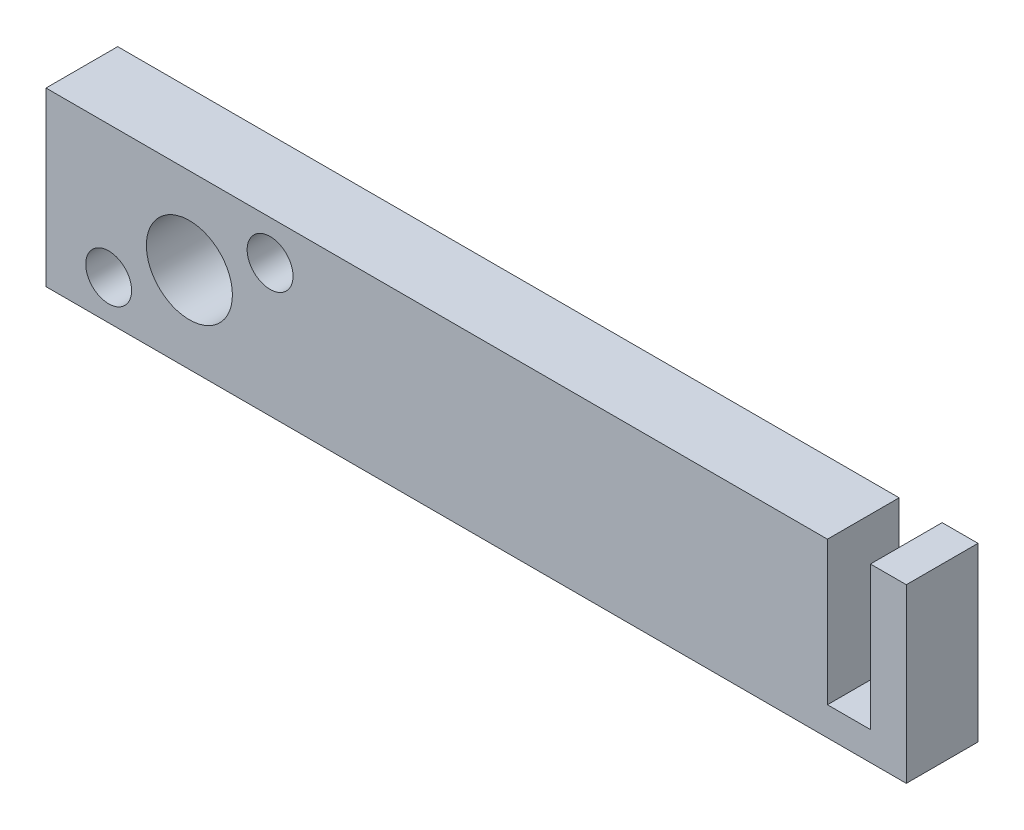
ISO-10303-21;
HEADER;
FILE_DESCRIPTION(('STEP AP214'),'2;1');
FILE_NAME('part.step','',(''),(''),'','','');
FILE_SCHEMA(('AUTOMOTIVE_DESIGN { 1 0 10303 214 1 1 1 1 }'));
ENDSEC;
DATA;
#1=APPLICATION_CONTEXT('core data for automotive mechanical design processes');
#2=APPLICATION_PROTOCOL_DEFINITION('international standard','automotive_design',2000,#1);
#3=PRODUCT_CONTEXT('',#1,'mechanical');
#4=PRODUCT('Part','Part','',(#3));
#5=PRODUCT_RELATED_PRODUCT_CATEGORY('part','',(#4));
#6=PRODUCT_DEFINITION_FORMATION('','',#4);
#7=PRODUCT_DEFINITION_CONTEXT('part definition',#1,'design');
#8=PRODUCT_DEFINITION('design','',#6,#7);
#9=PRODUCT_DEFINITION_SHAPE('','',#8);
#10=(LENGTH_UNIT() NAMED_UNIT(*) SI_UNIT(.MILLI.,.METRE.));
#11=(NAMED_UNIT(*) PLANE_ANGLE_UNIT() SI_UNIT($,.RADIAN.));
#12=(NAMED_UNIT(*) SI_UNIT($,.STERADIAN.) SOLID_ANGLE_UNIT());
#13=UNCERTAINTY_MEASURE_WITH_UNIT(LENGTH_MEASURE(1.E-05),#10,'distance_accuracy_value','');
#14=(GEOMETRIC_REPRESENTATION_CONTEXT(3) GLOBAL_UNCERTAINTY_ASSIGNED_CONTEXT((#13)) GLOBAL_UNIT_ASSIGNED_CONTEXT((#10,
#11,#12)) REPRESENTATION_CONTEXT('',''));
#15=CARTESIAN_POINT('',(0.,0.,0.));
#16=DIRECTION('',(0.,0.,1.));
#17=DIRECTION('',(1.,0.,0.));
#18=AXIS2_PLACEMENT_3D('',#15,#16,#17);
#19=CARTESIAN_POINT('',(-9.99999999999999,0.,5.));
#20=DIRECTION('',(1.,0.,0.));
#21=DIRECTION('',(0.,0.,-1.));
#22=AXIS2_PLACEMENT_3D('',#19,#20,#21);
#23=PLANE('',#22);
#24=DIRECTION('',(0.,-1.,0.));
#25=VECTOR('',#24,1.);
#26=CARTESIAN_POINT('',(-9.99999999999999,0.,0.));
#27=LINE('',#26,#25);
#28=CARTESIAN_POINT('',(-9.99999999999999,6.,0.));
#29=VERTEX_POINT('',#28);
#30=CARTESIAN_POINT('',(-9.99999999999999,-6.,0.));
#31=VERTEX_POINT('',#30);
#32=EDGE_CURVE('E145',#29,#31,#27,.T.);
#33=ORIENTED_EDGE('',*,*,#32,.T.);
#34=DIRECTION('',(0.,0.,-1.));
#35=VECTOR('',#34,1.);
#36=CARTESIAN_POINT('',(-9.99999999999999,-6.,5.));
#37=LINE('',#36,#35);
#38=CARTESIAN_POINT('',(-9.99999999999999,-6.,5.));
#39=VERTEX_POINT('',#38);
#40=EDGE_CURVE('E11',#39,#31,#37,.T.);
#41=ORIENTED_EDGE('',*,*,#40,.F.);
#42=DIRECTION('',(0.,-1.,0.));
#43=VECTOR('',#42,1.);
#44=CARTESIAN_POINT('',(-9.99999999999999,0.,5.));
#45=LINE('',#44,#43);
#46=CARTESIAN_POINT('',(-9.99999999999999,6.,5.));
#47=VERTEX_POINT('',#46);
#48=EDGE_CURVE('E195',#47,#39,#45,.T.);
#49=ORIENTED_EDGE('',*,*,#48,.F.);
#50=DIRECTION('',(0.,0.,-1.));
#51=VECTOR('',#50,1.);
#52=CARTESIAN_POINT('',(-9.99999999999999,6.,5.));
#53=LINE('',#52,#51);
#54=EDGE_CURVE('E138',#47,#29,#53,.T.);
#55=ORIENTED_EDGE('',*,*,#54,.T.);
#56=EDGE_LOOP('',(#33,#41,#49,#55));
#57=FACE_BOUND('',#56,.T.);
#58=ADVANCED_FACE('F38',(#57),#23,.F.);
#59=CARTESIAN_POINT('',(0.,-6.,5.));
#60=DIRECTION('',(0.,1.,0.));
#61=DIRECTION('',(0.,0.,1.));
#62=AXIS2_PLACEMENT_3D('',#59,#60,#61);
#63=PLANE('',#62);
#64=DIRECTION('',(1.,0.,0.));
#65=VECTOR('',#64,1.);
#66=CARTESIAN_POINT('',(0.,-6.,0.));
#67=LINE('',#66,#65);
#68=CARTESIAN_POINT('',(50.,-6.,0.));
#69=VERTEX_POINT('',#68);
#70=EDGE_CURVE('E148',#31,#69,#67,.T.);
#71=ORIENTED_EDGE('',*,*,#70,.T.);
#72=DIRECTION('',(0.,0.,-1.));
#73=VECTOR('',#72,1.);
#74=CARTESIAN_POINT('',(50.,-6.,5.));
#75=LINE('',#74,#73);
#76=CARTESIAN_POINT('',(50.,-6.,5.));
#77=VERTEX_POINT('',#76);
#78=EDGE_CURVE('E47',#77,#69,#75,.T.);
#79=ORIENTED_EDGE('',*,*,#78,.F.);
#80=DIRECTION('',(1.,0.,0.));
#81=VECTOR('',#80,1.);
#82=CARTESIAN_POINT('',(0.,-6.,5.));
#83=LINE('',#82,#81);
#84=EDGE_CURVE('E98',#39,#77,#83,.T.);
#85=ORIENTED_EDGE('',*,*,#84,.F.);
#86=ORIENTED_EDGE('',*,*,#40,.T.);
#87=EDGE_LOOP('',(#71,#79,#85,#86));
#88=FACE_BOUND('',#87,.T.);
#89=ADVANCED_FACE('F224',(#88),#63,.F.);
#90=CARTESIAN_POINT('',(50.,0.,5.));
#91=DIRECTION('',(-1.,0.,0.));
#92=DIRECTION('',(0.,0.,1.));
#93=AXIS2_PLACEMENT_3D('',#90,#91,#92);
#94=PLANE('',#93);
#95=DIRECTION('',(0.,1.,0.));
#96=VECTOR('',#95,1.);
#97=CARTESIAN_POINT('',(50.,0.,0.));
#98=LINE('',#97,#96);
#99=CARTESIAN_POINT('',(50.,6.,0.));
#100=VERTEX_POINT('',#99);
#101=EDGE_CURVE('E150',#69,#100,#98,.T.);
#102=ORIENTED_EDGE('',*,*,#101,.T.);
#103=DIRECTION('',(0.,0.,-1.));
#104=VECTOR('',#103,1.);
#105=CARTESIAN_POINT('',(50.,6.,5.));
#106=LINE('',#105,#104);
#107=CARTESIAN_POINT('',(50.,6.,5.));
#108=VERTEX_POINT('',#107);
#109=EDGE_CURVE('E169',#108,#100,#106,.T.);
#110=ORIENTED_EDGE('',*,*,#109,.F.);
#111=DIRECTION('',(0.,1.,0.));
#112=VECTOR('',#111,1.);
#113=CARTESIAN_POINT('',(50.,0.,5.));
#114=LINE('',#113,#112);
#115=EDGE_CURVE('E177',#77,#108,#114,.T.);
#116=ORIENTED_EDGE('',*,*,#115,.F.);
#117=ORIENTED_EDGE('',*,*,#78,.T.);
#118=EDGE_LOOP('',(#102,#110,#116,#117));
#119=FACE_BOUND('',#118,.T.);
#120=ADVANCED_FACE('F175',(#119),#94,.F.);
#121=CARTESIAN_POINT('',(0.,6.,5.));
#122=DIRECTION('',(0.,-1.,0.));
#123=DIRECTION('',(0.,0.,-1.));
#124=AXIS2_PLACEMENT_3D('',#121,#122,#123);
#125=PLANE('',#124);
#126=DIRECTION('',(-1.,0.,0.));
#127=VECTOR('',#126,1.);
#128=CARTESIAN_POINT('',(0.,6.,0.));
#129=LINE('',#128,#127);
#130=CARTESIAN_POINT('',(47.5,6.,0.));
#131=VERTEX_POINT('',#130);
#132=EDGE_CURVE('E152',#100,#131,#129,.T.);
#133=ORIENTED_EDGE('',*,*,#132,.T.);
#134=DIRECTION('',(0.,0.,-1.));
#135=VECTOR('',#134,1.);
#136=CARTESIAN_POINT('',(47.5,6.,5.));
#137=LINE('',#136,#135);
#138=CARTESIAN_POINT('',(47.5,6.,5.));
#139=VERTEX_POINT('',#138);
#140=EDGE_CURVE('E166',#139,#131,#137,.T.);
#141=ORIENTED_EDGE('',*,*,#140,.F.);
#142=DIRECTION('',(-1.,0.,0.));
#143=VECTOR('',#142,1.);
#144=CARTESIAN_POINT('',(0.,6.,5.));
#145=LINE('',#144,#143);
#146=EDGE_CURVE('E190',#108,#139,#145,.T.);
#147=ORIENTED_EDGE('',*,*,#146,.F.);
#148=ORIENTED_EDGE('',*,*,#109,.T.);
#149=EDGE_LOOP('',(#133,#141,#147,#148));
#150=FACE_BOUND('',#149,.T.);
#151=ADVANCED_FACE('F186',(#150),#125,.F.);
#152=CARTESIAN_POINT('',(47.5,0.,5.));
#153=DIRECTION('',(1.,0.,0.));
#154=DIRECTION('',(0.,0.,-1.));
#155=AXIS2_PLACEMENT_3D('',#152,#153,#154);
#156=PLANE('',#155);
#157=DIRECTION('',(0.,-1.,0.));
#158=VECTOR('',#157,1.);
#159=CARTESIAN_POINT('',(47.5,0.,0.));
#160=LINE('',#159,#158);
#161=CARTESIAN_POINT('',(47.5,-4.,0.));
#162=VERTEX_POINT('',#161);
#163=EDGE_CURVE('E154',#131,#162,#160,.T.);
#164=ORIENTED_EDGE('',*,*,#163,.T.);
#165=DIRECTION('',(0.,0.,-1.));
#166=VECTOR('',#165,1.);
#167=CARTESIAN_POINT('',(47.5,-4.,5.));
#168=LINE('',#167,#166);
#169=CARTESIAN_POINT('',(47.5,-4.,5.));
#170=VERTEX_POINT('',#169);
#171=EDGE_CURVE('E127',#170,#162,#168,.T.);
#172=ORIENTED_EDGE('',*,*,#171,.F.);
#173=DIRECTION('',(0.,-1.,0.));
#174=VECTOR('',#173,1.);
#175=CARTESIAN_POINT('',(47.5,0.,5.));
#176=LINE('',#175,#174);
#177=EDGE_CURVE('E118',#139,#170,#176,.T.);
#178=ORIENTED_EDGE('',*,*,#177,.F.);
#179=ORIENTED_EDGE('',*,*,#140,.T.);
#180=EDGE_LOOP('',(#164,#172,#178,#179));
#181=FACE_BOUND('',#180,.T.);
#182=ADVANCED_FACE('F189',(#181),#156,.F.);
#183=CARTESIAN_POINT('',(0.,-4.,5.));
#184=DIRECTION('',(0.,-1.,0.));
#185=DIRECTION('',(0.,0.,-1.));
#186=AXIS2_PLACEMENT_3D('',#183,#184,#185);
#187=PLANE('',#186);
#188=DIRECTION('',(-1.,0.,0.));
#189=VECTOR('',#188,1.);
#190=CARTESIAN_POINT('',(0.,-4.,0.));
#191=LINE('',#190,#189);
#192=CARTESIAN_POINT('',(44.5,-4.,0.));
#193=VERTEX_POINT('',#192);
#194=EDGE_CURVE('E126',#162,#193,#191,.T.);
#195=ORIENTED_EDGE('',*,*,#194,.T.);
#196=DIRECTION('',(0.,0.,-1.));
#197=VECTOR('',#196,1.);
#198=CARTESIAN_POINT('',(44.5,-4.,5.));
#199=LINE('',#198,#197);
#200=CARTESIAN_POINT('',(44.5,-4.,5.));
#201=VERTEX_POINT('',#200);
#202=EDGE_CURVE('E123',#201,#193,#199,.T.);
#203=ORIENTED_EDGE('',*,*,#202,.F.);
#204=DIRECTION('',(-1.,0.,0.));
#205=VECTOR('',#204,1.);
#206=CARTESIAN_POINT('',(0.,-4.,5.));
#207=LINE('',#206,#205);
#208=EDGE_CURVE('E111',#170,#201,#207,.T.);
#209=ORIENTED_EDGE('',*,*,#208,.F.);
#210=ORIENTED_EDGE('',*,*,#171,.T.);
#211=EDGE_LOOP('',(#195,#203,#209,#210));
#212=FACE_BOUND('',#211,.T.);
#213=ADVANCED_FACE('F124',(#212),#187,.F.);
#214=CARTESIAN_POINT('',(44.5,0.,5.));
#215=DIRECTION('',(-1.,0.,0.));
#216=DIRECTION('',(0.,0.,1.));
#217=AXIS2_PLACEMENT_3D('',#214,#215,#216);
#218=PLANE('',#217);
#219=DIRECTION('',(0.,1.,0.));
#220=VECTOR('',#219,1.);
#221=CARTESIAN_POINT('',(44.5,0.,0.));
#222=LINE('',#221,#220);
#223=CARTESIAN_POINT('',(44.5,6.,0.));
#224=VERTEX_POINT('',#223);
#225=EDGE_CURVE('E84',#193,#224,#222,.T.);
#226=ORIENTED_EDGE('',*,*,#225,.T.);
#227=DIRECTION('',(0.,0.,-1.));
#228=VECTOR('',#227,1.);
#229=CARTESIAN_POINT('',(44.5,6.,5.));
#230=LINE('',#229,#228);
#231=CARTESIAN_POINT('',(44.5,6.,5.));
#232=VERTEX_POINT('',#231);
#233=EDGE_CURVE('E128',#232,#224,#230,.T.);
#234=ORIENTED_EDGE('',*,*,#233,.F.);
#235=DIRECTION('',(0.,1.,0.));
#236=VECTOR('',#235,1.);
#237=CARTESIAN_POINT('',(44.5,0.,5.));
#238=LINE('',#237,#236);
#239=EDGE_CURVE('E116',#201,#232,#238,.T.);
#240=ORIENTED_EDGE('',*,*,#239,.F.);
#241=ORIENTED_EDGE('',*,*,#202,.T.);
#242=EDGE_LOOP('',(#226,#234,#240,#241));
#243=FACE_BOUND('',#242,.T.);
#244=ADVANCED_FACE('F130',(#243),#218,.F.);
#245=CARTESIAN_POINT('',(0.,6.,5.));
#246=DIRECTION('',(0.,-1.,0.));
#247=DIRECTION('',(0.,0.,-1.));
#248=AXIS2_PLACEMENT_3D('',#245,#246,#247);
#249=PLANE('',#248);
#250=DIRECTION('',(-1.,0.,0.));
#251=VECTOR('',#250,1.);
#252=CARTESIAN_POINT('',(0.,6.,0.));
#253=LINE('',#252,#251);
#254=EDGE_CURVE('E90',#224,#29,#253,.T.);
#255=ORIENTED_EDGE('',*,*,#254,.T.);
#256=ORIENTED_EDGE('',*,*,#54,.F.);
#257=DIRECTION('',(-1.,0.,0.));
#258=VECTOR('',#257,1.);
#259=CARTESIAN_POINT('',(0.,6.,5.));
#260=LINE('',#259,#258);
#261=EDGE_CURVE('E55',#232,#47,#260,.T.);
#262=ORIENTED_EDGE('',*,*,#261,.F.);
#263=ORIENTED_EDGE('',*,*,#233,.T.);
#264=EDGE_LOOP('',(#255,#256,#262,#263));
#265=FACE_BOUND('',#264,.T.);
#266=ADVANCED_FACE('F214',(#265),#249,.F.);
#267=CARTESIAN_POINT('',(5.62916512459885,3.25000000000001,5.));
#268=DIRECTION('',(0.,0.,-1.));
#269=DIRECTION('',(-1.,0.,0.));
#270=AXIS2_PLACEMENT_3D('',#267,#268,#269);
#271=CYLINDRICAL_SURFACE('',#270,1.6);
#272=CARTESIAN_POINT('',(5.62916512459885,3.25000000000001,5.));
#273=DIRECTION('',(0.,0.,1.));
#274=DIRECTION('',(1.,0.,0.));
#275=AXIS2_PLACEMENT_3D('',#272,#273,#274);
#276=CIRCLE('',#275,1.6);
#277=CARTESIAN_POINT('',(7.22916512459885,3.25000000000001,5.));
#278=VERTEX_POINT('',#277);
#279=EDGE_CURVE('E197',#278,#278,#276,.T.);
#280=ORIENTED_EDGE('',*,*,#279,.T.);
#281=EDGE_LOOP('',(#280));
#282=FACE_BOUND('',#281,.T.);
#283=CARTESIAN_POINT('',(5.62916512459885,3.25000000000001,0.));
#284=DIRECTION('',(0.,0.,1.));
#285=DIRECTION('',(1.,0.,0.));
#286=AXIS2_PLACEMENT_3D('',#283,#284,#285);
#287=CIRCLE('',#286,1.6);
#288=CARTESIAN_POINT('',(7.22916512459885,3.25000000000001,0.));
#289=VERTEX_POINT('',#288);
#290=EDGE_CURVE('E142',#289,#289,#287,.T.);
#291=ORIENTED_EDGE('',*,*,#290,.F.);
#292=EDGE_LOOP('',(#291));
#293=FACE_BOUND('',#292,.T.);
#294=ADVANCED_FACE('F211',(#282,#293),#271,.F.);
#295=CARTESIAN_POINT('',(-5.62916512459884,-3.25000000000001,5.));
#296=DIRECTION('',(0.,0.,-1.));
#297=DIRECTION('',(-1.,0.,0.));
#298=AXIS2_PLACEMENT_3D('',#295,#296,#297);
#299=CYLINDRICAL_SURFACE('',#298,1.6);
#300=CARTESIAN_POINT('',(-5.62916512459884,-3.25000000000001,5.));
#301=DIRECTION('',(0.,0.,1.));
#302=DIRECTION('',(1.,0.,0.));
#303=AXIS2_PLACEMENT_3D('',#300,#301,#302);
#304=CIRCLE('',#303,1.6);
#305=CARTESIAN_POINT('',(-4.02916512459884,-3.25000000000001,5.));
#306=VERTEX_POINT('',#305);
#307=EDGE_CURVE('E162',#306,#306,#304,.T.);
#308=ORIENTED_EDGE('',*,*,#307,.T.);
#309=EDGE_LOOP('',(#308));
#310=FACE_BOUND('',#309,.T.);
#311=CARTESIAN_POINT('',(-5.62916512459884,-3.25000000000001,0.));
#312=DIRECTION('',(0.,0.,1.));
#313=DIRECTION('',(1.,0.,0.));
#314=AXIS2_PLACEMENT_3D('',#311,#312,#313);
#315=CIRCLE('',#314,1.6);
#316=CARTESIAN_POINT('',(-4.02916512459884,-3.25000000000001,0.));
#317=VERTEX_POINT('',#316);
#318=EDGE_CURVE('E139',#317,#317,#315,.T.);
#319=ORIENTED_EDGE('',*,*,#318,.F.);
#320=EDGE_LOOP('',(#319));
#321=FACE_BOUND('',#320,.T.);
#322=ADVANCED_FACE('F40',(#310,#321),#299,.F.);
#323=CARTESIAN_POINT('',(0.,0.,5.));
#324=DIRECTION('',(0.,0.,-1.));
#325=DIRECTION('',(-1.,0.,0.));
#326=AXIS2_PLACEMENT_3D('',#323,#324,#325);
#327=CYLINDRICAL_SURFACE('',#326,3.);
#328=CARTESIAN_POINT('',(0.,0.,5.));
#329=DIRECTION('',(0.,0.,1.));
#330=DIRECTION('',(1.,0.,0.));
#331=AXIS2_PLACEMENT_3D('',#328,#329,#330);
#332=CIRCLE('',#331,3.);
#333=CARTESIAN_POINT('',(3.,0.,5.));
#334=VERTEX_POINT('',#333);
#335=EDGE_CURVE('E132',#334,#334,#332,.T.);
#336=ORIENTED_EDGE('',*,*,#335,.T.);
#337=EDGE_LOOP('',(#336));
#338=FACE_BOUND('',#337,.T.);
#339=CARTESIAN_POINT('',(0.,0.,0.));
#340=DIRECTION('',(0.,0.,1.));
#341=DIRECTION('',(1.,0.,0.));
#342=AXIS2_PLACEMENT_3D('',#339,#340,#341);
#343=CIRCLE('',#342,3.);
#344=CARTESIAN_POINT('',(3.,0.,0.));
#345=VERTEX_POINT('',#344);
#346=EDGE_CURVE('E159',#345,#345,#343,.T.);
#347=ORIENTED_EDGE('',*,*,#346,.F.);
#348=EDGE_LOOP('',(#347));
#349=FACE_BOUND('',#348,.T.);
#350=ADVANCED_FACE('F207',(#338,#349),#327,.F.);
#351=CARTESIAN_POINT('',(0.,0.,5.));
#352=DIRECTION('',(0.,0.,1.));
#353=DIRECTION('',(1.,0.,0.));
#354=AXIS2_PLACEMENT_3D('',#351,#352,#353);
#355=PLANE('',#354);
#356=ORIENTED_EDGE('',*,*,#307,.F.);
#357=EDGE_LOOP('',(#356));
#358=FACE_BOUND('',#357,.T.);
#359=ORIENTED_EDGE('',*,*,#279,.F.);
#360=EDGE_LOOP('',(#359));
#361=FACE_BOUND('',#360,.T.);
#362=ORIENTED_EDGE('',*,*,#48,.T.);
#363=ORIENTED_EDGE('',*,*,#84,.T.);
#364=ORIENTED_EDGE('',*,*,#115,.T.);
#365=ORIENTED_EDGE('',*,*,#146,.T.);
#366=ORIENTED_EDGE('',*,*,#177,.T.);
#367=ORIENTED_EDGE('',*,*,#208,.T.);
#368=ORIENTED_EDGE('',*,*,#239,.T.);
#369=ORIENTED_EDGE('',*,*,#261,.T.);
#370=EDGE_LOOP('',(#362,#363,#364,#365,#366,#367,#368,#369));
#371=FACE_BOUND('',#370,.T.);
#372=ORIENTED_EDGE('',*,*,#335,.F.);
#373=EDGE_LOOP('',(#372));
#374=FACE_BOUND('',#373,.T.);
#375=ADVANCED_FACE('F113',(#358,#361,#371,#374),#355,.T.);
#376=CARTESIAN_POINT('',(0.,0.,0.));
#377=DIRECTION('',(0.,0.,1.));
#378=DIRECTION('',(1.,0.,0.));
#379=AXIS2_PLACEMENT_3D('',#376,#377,#378);
#380=PLANE('',#379);
#381=ORIENTED_EDGE('',*,*,#318,.T.);
#382=EDGE_LOOP('',(#381));
#383=FACE_BOUND('',#382,.T.);
#384=ORIENTED_EDGE('',*,*,#290,.T.);
#385=EDGE_LOOP('',(#384));
#386=FACE_BOUND('',#385,.T.);
#387=ORIENTED_EDGE('',*,*,#32,.F.);
#388=ORIENTED_EDGE('',*,*,#254,.F.);
#389=ORIENTED_EDGE('',*,*,#225,.F.);
#390=ORIENTED_EDGE('',*,*,#194,.F.);
#391=ORIENTED_EDGE('',*,*,#163,.F.);
#392=ORIENTED_EDGE('',*,*,#132,.F.);
#393=ORIENTED_EDGE('',*,*,#101,.F.);
#394=ORIENTED_EDGE('',*,*,#70,.F.);
#395=EDGE_LOOP('',(#387,#388,#389,#390,#391,#392,#393,#394));
#396=FACE_BOUND('',#395,.T.);
#397=ORIENTED_EDGE('',*,*,#346,.T.);
#398=EDGE_LOOP('',(#397));
#399=FACE_BOUND('',#398,.T.);
#400=ADVANCED_FACE('F181',(#383,#386,#396,#399),#380,.F.);
#401=CLOSED_SHELL('',(#58,#89,#120,#151,#182,#213,#244,#266,#294,#322,#350,#375,#400));
#402=MANIFOLD_SOLID_BREP('B2',#401);
#403=ADVANCED_BREP_SHAPE_REPRESENTATION('',(#18,#402),#14);
#404=SHAPE_DEFINITION_REPRESENTATION(#9,#403);
ENDSEC;
END-ISO-10303-21;
